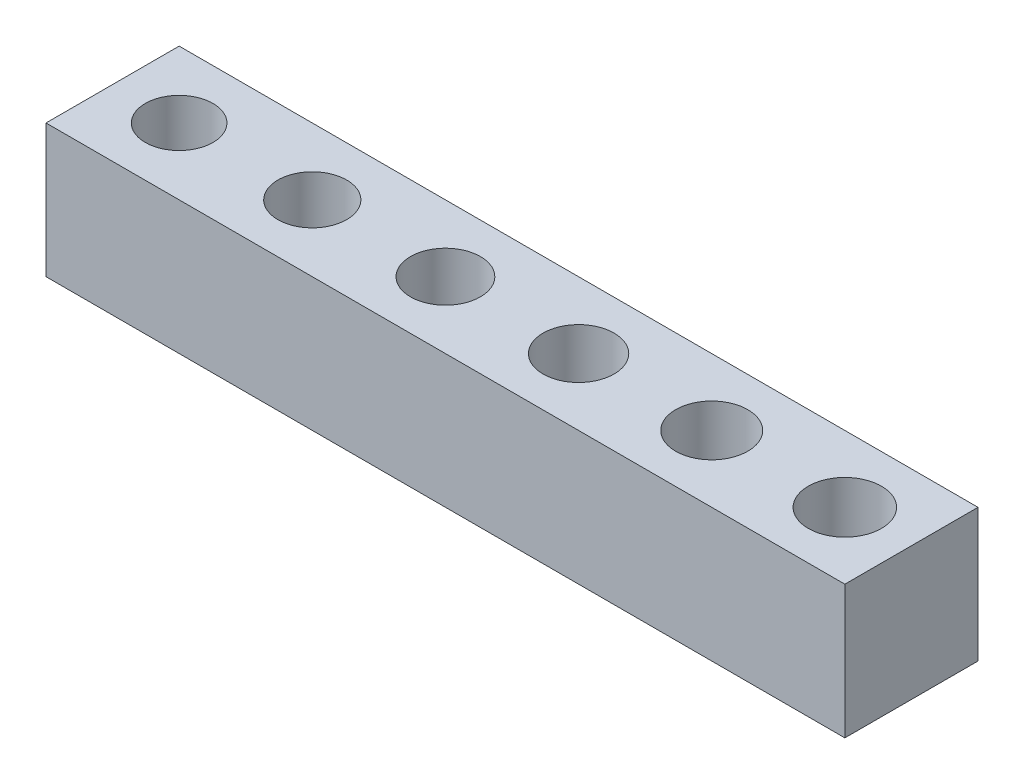
ISO-10303-21;
HEADER;
FILE_DESCRIPTION(('STEP AP214'),'2;1');
FILE_NAME('part.step','',(''),(''),'','','');
FILE_SCHEMA(('AUTOMOTIVE_DESIGN { 1 0 10303 214 1 1 1 1 }'));
ENDSEC;
DATA;
#1=APPLICATION_CONTEXT('core data for automotive mechanical design processes');
#2=APPLICATION_PROTOCOL_DEFINITION('international standard','automotive_design',2000,#1);
#3=PRODUCT_CONTEXT('',#1,'mechanical');
#4=PRODUCT('Part','Part','',(#3));
#5=PRODUCT_RELATED_PRODUCT_CATEGORY('part','',(#4));
#6=PRODUCT_DEFINITION_FORMATION('','',#4);
#7=PRODUCT_DEFINITION_CONTEXT('part definition',#1,'design');
#8=PRODUCT_DEFINITION('design','',#6,#7);
#9=PRODUCT_DEFINITION_SHAPE('','',#8);
#10=(LENGTH_UNIT() NAMED_UNIT(*) SI_UNIT(.MILLI.,.METRE.));
#11=(NAMED_UNIT(*) PLANE_ANGLE_UNIT() SI_UNIT($,.RADIAN.));
#12=(NAMED_UNIT(*) SI_UNIT($,.STERADIAN.) SOLID_ANGLE_UNIT());
#13=UNCERTAINTY_MEASURE_WITH_UNIT(LENGTH_MEASURE(1.E-05),#10,'distance_accuracy_value','');
#14=(GEOMETRIC_REPRESENTATION_CONTEXT(3) GLOBAL_UNCERTAINTY_ASSIGNED_CONTEXT((#13)) GLOBAL_UNIT_ASSIGNED_CONTEXT((#10,
#11,#12)) REPRESENTATION_CONTEXT('',''));
#15=CARTESIAN_POINT('',(0.,0.,0.));
#16=DIRECTION('',(0.,0.,1.));
#17=DIRECTION('',(1.,0.,0.));
#18=AXIS2_PLACEMENT_3D('',#15,#16,#17);
#19=CARTESIAN_POINT('',(6.,12.,-6.));
#20=DIRECTION('',(0.,-1.,0.));
#21=DIRECTION('',(0.,0.,-1.));
#22=AXIS2_PLACEMENT_3D('',#19,#20,#21);
#23=CYLINDRICAL_SURFACE('',#22,2.475);
#24=CARTESIAN_POINT('',(6.,0.,-6.));
#25=DIRECTION('',(0.,1.,0.));
#26=DIRECTION('',(0.,0.,1.));
#27=AXIS2_PLACEMENT_3D('',#24,#25,#26);
#28=CIRCLE('',#27,2.475);
#29=CARTESIAN_POINT('',(6.,0.,-3.525));
#30=VERTEX_POINT('',#29);
#31=EDGE_CURVE('E129',#30,#30,#28,.T.);
#32=ORIENTED_EDGE('',*,*,#31,.F.);
#33=EDGE_LOOP('',(#32));
#34=FACE_BOUND('',#33,.T.);
#35=CARTESIAN_POINT('',(6.,6.25,-6.));
#36=DIRECTION('',(0.,1.,0.));
#37=DIRECTION('',(0.,0.,1.));
#38=AXIS2_PLACEMENT_3D('',#35,#36,#37);
#39=CIRCLE('',#38,2.475);
#40=CARTESIAN_POINT('',(6.,6.25,-3.525));
#41=VERTEX_POINT('',#40);
#42=EDGE_CURVE('E43',#41,#41,#39,.T.);
#43=ORIENTED_EDGE('',*,*,#42,.T.);
#44=EDGE_LOOP('',(#43));
#45=FACE_BOUND('',#44,.T.);
#46=ADVANCED_FACE('F39',(#34,#45),#23,.F.);
#47=CARTESIAN_POINT('',(18.,12.,-6.));
#48=DIRECTION('',(0.,-1.,0.));
#49=DIRECTION('',(0.,0.,-1.));
#50=AXIS2_PLACEMENT_3D('',#47,#48,#49);
#51=CYLINDRICAL_SURFACE('',#50,2.475);
#52=CARTESIAN_POINT('',(18.,0.,-6.));
#53=DIRECTION('',(0.,1.,0.));
#54=DIRECTION('',(0.,0.,1.));
#55=AXIS2_PLACEMENT_3D('',#52,#53,#54);
#56=CIRCLE('',#55,2.475);
#57=CARTESIAN_POINT('',(18.,0.,-3.525));
#58=VERTEX_POINT('',#57);
#59=EDGE_CURVE('E119',#58,#58,#56,.T.);
#60=ORIENTED_EDGE('',*,*,#59,.F.);
#61=EDGE_LOOP('',(#60));
#62=FACE_BOUND('',#61,.T.);
#63=CARTESIAN_POINT('',(18.,6.25,-6.));
#64=DIRECTION('',(0.,1.,0.));
#65=DIRECTION('',(0.,0.,1.));
#66=AXIS2_PLACEMENT_3D('',#63,#64,#65);
#67=CIRCLE('',#66,2.475);
#68=CARTESIAN_POINT('',(18.,6.25,-3.525));
#69=VERTEX_POINT('',#68);
#70=EDGE_CURVE('E146',#69,#69,#67,.T.);
#71=ORIENTED_EDGE('',*,*,#70,.T.);
#72=EDGE_LOOP('',(#71));
#73=FACE_BOUND('',#72,.T.);
#74=ADVANCED_FACE('F204',(#62,#73),#51,.F.);
#75=CARTESIAN_POINT('',(-6.,12.,-6.));
#76=DIRECTION('',(0.,-1.,0.));
#77=DIRECTION('',(0.,0.,-1.));
#78=AXIS2_PLACEMENT_3D('',#75,#76,#77);
#79=CYLINDRICAL_SURFACE('',#78,2.475);
#80=CARTESIAN_POINT('',(-6.,0.,-6.));
#81=DIRECTION('',(0.,1.,0.));
#82=DIRECTION('',(0.,0.,1.));
#83=AXIS2_PLACEMENT_3D('',#80,#81,#82);
#84=CIRCLE('',#83,2.475);
#85=CARTESIAN_POINT('',(-6.,0.,-3.525));
#86=VERTEX_POINT('',#85);
#87=EDGE_CURVE('E116',#86,#86,#84,.T.);
#88=ORIENTED_EDGE('',*,*,#87,.F.);
#89=EDGE_LOOP('',(#88));
#90=FACE_BOUND('',#89,.T.);
#91=CARTESIAN_POINT('',(-6.,6.25,-6.));
#92=DIRECTION('',(0.,1.,0.));
#93=DIRECTION('',(0.,0.,1.));
#94=AXIS2_PLACEMENT_3D('',#91,#92,#93);
#95=CIRCLE('',#94,2.475);
#96=CARTESIAN_POINT('',(-6.,6.25,-3.525));
#97=VERTEX_POINT('',#96);
#98=EDGE_CURVE('E144',#97,#97,#95,.T.);
#99=ORIENTED_EDGE('',*,*,#98,.T.);
#100=EDGE_LOOP('',(#99));
#101=FACE_BOUND('',#100,.T.);
#102=ADVANCED_FACE('F210',(#90,#101),#79,.F.);
#103=CARTESIAN_POINT('',(-18.,12.,-6.));
#104=DIRECTION('',(0.,-1.,0.));
#105=DIRECTION('',(0.,0.,-1.));
#106=AXIS2_PLACEMENT_3D('',#103,#104,#105);
#107=CYLINDRICAL_SURFACE('',#106,2.475);
#108=CARTESIAN_POINT('',(-18.,0.,-6.));
#109=DIRECTION('',(0.,1.,0.));
#110=DIRECTION('',(0.,0.,1.));
#111=AXIS2_PLACEMENT_3D('',#108,#109,#110);
#112=CIRCLE('',#111,2.475);
#113=CARTESIAN_POINT('',(-18.,0.,-3.525));
#114=VERTEX_POINT('',#113);
#115=EDGE_CURVE('E113',#114,#114,#112,.T.);
#116=ORIENTED_EDGE('',*,*,#115,.F.);
#117=EDGE_LOOP('',(#116));
#118=FACE_BOUND('',#117,.T.);
#119=CARTESIAN_POINT('',(-18.,6.25,-6.));
#120=DIRECTION('',(0.,1.,0.));
#121=DIRECTION('',(0.,0.,1.));
#122=AXIS2_PLACEMENT_3D('',#119,#120,#121);
#123=CIRCLE('',#122,2.475);
#124=CARTESIAN_POINT('',(-18.,6.25,-3.525));
#125=VERTEX_POINT('',#124);
#126=EDGE_CURVE('E141',#125,#125,#123,.T.);
#127=ORIENTED_EDGE('',*,*,#126,.T.);
#128=EDGE_LOOP('',(#127));
#129=FACE_BOUND('',#128,.T.);
#130=ADVANCED_FACE('F221',(#118,#129),#107,.F.);
#131=CARTESIAN_POINT('',(-30.,12.,-6.));
#132=DIRECTION('',(0.,-1.,0.));
#133=DIRECTION('',(0.,0.,-1.));
#134=AXIS2_PLACEMENT_3D('',#131,#132,#133);
#135=CYLINDRICAL_SURFACE('',#134,2.475);
#136=CARTESIAN_POINT('',(-30.,0.,-6.));
#137=DIRECTION('',(0.,1.,0.));
#138=DIRECTION('',(0.,0.,1.));
#139=AXIS2_PLACEMENT_3D('',#136,#137,#138);
#140=CIRCLE('',#139,2.475);
#141=CARTESIAN_POINT('',(-30.,0.,-3.525));
#142=VERTEX_POINT('',#141);
#143=EDGE_CURVE('E110',#142,#142,#140,.T.);
#144=ORIENTED_EDGE('',*,*,#143,.F.);
#145=EDGE_LOOP('',(#144));
#146=FACE_BOUND('',#145,.T.);
#147=CARTESIAN_POINT('',(-30.,6.25,-6.));
#148=DIRECTION('',(0.,1.,0.));
#149=DIRECTION('',(0.,0.,1.));
#150=AXIS2_PLACEMENT_3D('',#147,#148,#149);
#151=CIRCLE('',#150,2.475);
#152=CARTESIAN_POINT('',(-30.,6.25,-3.525));
#153=VERTEX_POINT('',#152);
#154=EDGE_CURVE('E137',#153,#153,#151,.T.);
#155=ORIENTED_EDGE('',*,*,#154,.T.);
#156=EDGE_LOOP('',(#155));
#157=FACE_BOUND('',#156,.T.);
#158=ADVANCED_FACE('F197',(#146,#157),#135,.F.);
#159=CARTESIAN_POINT('',(-42.,12.,-6.));
#160=DIRECTION('',(0.,-1.,0.));
#161=DIRECTION('',(0.,0.,-1.));
#162=AXIS2_PLACEMENT_3D('',#159,#160,#161);
#163=CYLINDRICAL_SURFACE('',#162,2.475);
#164=CARTESIAN_POINT('',(-42.,0.,-6.));
#165=DIRECTION('',(0.,1.,0.));
#166=DIRECTION('',(0.,0.,1.));
#167=AXIS2_PLACEMENT_3D('',#164,#165,#166);
#168=CIRCLE('',#167,2.475);
#169=CARTESIAN_POINT('',(-42.,0.,-3.525));
#170=VERTEX_POINT('',#169);
#171=EDGE_CURVE('E103',#170,#170,#168,.T.);
#172=ORIENTED_EDGE('',*,*,#171,.F.);
#173=EDGE_LOOP('',(#172));
#174=FACE_BOUND('',#173,.T.);
#175=CARTESIAN_POINT('',(-42.,6.25,-6.));
#176=DIRECTION('',(0.,1.,0.));
#177=DIRECTION('',(0.,0.,1.));
#178=AXIS2_PLACEMENT_3D('',#175,#176,#177);
#179=CIRCLE('',#178,2.475);
#180=CARTESIAN_POINT('',(-42.,6.25,-3.525));
#181=VERTEX_POINT('',#180);
#182=EDGE_CURVE('E134',#181,#181,#179,.T.);
#183=ORIENTED_EDGE('',*,*,#182,.T.);
#184=EDGE_LOOP('',(#183));
#185=FACE_BOUND('',#184,.T.);
#186=ADVANCED_FACE('F188',(#174,#185),#163,.F.);
#187=CARTESIAN_POINT('',(0.,12.,0.));
#188=DIRECTION('',(0.,-1.,0.));
#189=DIRECTION('',(0.,0.,-1.));
#190=AXIS2_PLACEMENT_3D('',#187,#188,#189);
#191=PLANE('',#190);
#192=CARTESIAN_POINT('',(-42.,12.,-6.));
#193=DIRECTION('',(0.,1.,0.));
#194=DIRECTION('',(0.,0.,1.));
#195=AXIS2_PLACEMENT_3D('',#192,#193,#194);
#196=CIRCLE('',#195,3.05);
#197=CARTESIAN_POINT('',(-42.,12.,-2.95));
#198=VERTEX_POINT('',#197);
#199=EDGE_CURVE('E270',#198,#198,#196,.T.);
#200=ORIENTED_EDGE('',*,*,#199,.F.);
#201=EDGE_LOOP('',(#200));
#202=FACE_BOUND('',#201,.T.);
#203=CARTESIAN_POINT('',(-30.,12.,-6.));
#204=DIRECTION('',(0.,1.,0.));
#205=DIRECTION('',(0.,0.,1.));
#206=AXIS2_PLACEMENT_3D('',#203,#204,#205);
#207=CIRCLE('',#206,3.1);
#208=CARTESIAN_POINT('',(-30.,12.,-2.9));
#209=VERTEX_POINT('',#208);
#210=EDGE_CURVE('E273',#209,#209,#207,.T.);
#211=ORIENTED_EDGE('',*,*,#210,.F.);
#212=EDGE_LOOP('',(#211));
#213=FACE_BOUND('',#212,.T.);
#214=CARTESIAN_POINT('',(-18.,12.,-6.));
#215=DIRECTION('',(0.,1.,0.));
#216=DIRECTION('',(0.,0.,1.));
#217=AXIS2_PLACEMENT_3D('',#214,#215,#216);
#218=CIRCLE('',#217,3.15);
#219=CARTESIAN_POINT('',(-18.,12.,-2.85));
#220=VERTEX_POINT('',#219);
#221=EDGE_CURVE('E281',#220,#220,#218,.T.);
#222=ORIENTED_EDGE('',*,*,#221,.F.);
#223=EDGE_LOOP('',(#222));
#224=FACE_BOUND('',#223,.T.);
#225=CARTESIAN_POINT('',(-6.,12.,-6.));
#226=DIRECTION('',(0.,1.,0.));
#227=DIRECTION('',(0.,0.,1.));
#228=AXIS2_PLACEMENT_3D('',#225,#226,#227);
#229=CIRCLE('',#228,3.2);
#230=CARTESIAN_POINT('',(-6.,12.,-2.8));
#231=VERTEX_POINT('',#230);
#232=EDGE_CURVE('E287',#231,#231,#229,.T.);
#233=ORIENTED_EDGE('',*,*,#232,.F.);
#234=EDGE_LOOP('',(#233));
#235=FACE_BOUND('',#234,.T.);
#236=CARTESIAN_POINT('',(6.,12.,-6.));
#237=DIRECTION('',(0.,1.,0.));
#238=DIRECTION('',(0.,0.,1.));
#239=AXIS2_PLACEMENT_3D('',#236,#237,#238);
#240=CIRCLE('',#239,3.25);
#241=CARTESIAN_POINT('',(6.,12.,-2.75));
#242=VERTEX_POINT('',#241);
#243=EDGE_CURVE('E163',#242,#242,#240,.T.);
#244=ORIENTED_EDGE('',*,*,#243,.F.);
#245=EDGE_LOOP('',(#244));
#246=FACE_BOUND('',#245,.T.);
#247=CARTESIAN_POINT('',(18.,12.,-6.));
#248=DIRECTION('',(0.,1.,0.));
#249=DIRECTION('',(0.,0.,1.));
#250=AXIS2_PLACEMENT_3D('',#247,#248,#249);
#251=CIRCLE('',#250,3.3);
#252=CARTESIAN_POINT('',(18.,12.,-2.7));
#253=VERTEX_POINT('',#252);
#254=EDGE_CURVE('E164',#253,#253,#251,.T.);
#255=ORIENTED_EDGE('',*,*,#254,.F.);
#256=EDGE_LOOP('',(#255));
#257=FACE_BOUND('',#256,.T.);
#258=DIRECTION('',(-1.,0.,0.));
#259=VECTOR('',#258,1.);
#260=CARTESIAN_POINT('',(0.,12.,-12.));
#261=LINE('',#260,#259);
#262=CARTESIAN_POINT('',(24.,12.,-12.));
#263=VERTEX_POINT('',#262);
#264=CARTESIAN_POINT('',(-48.,12.,-12.));
#265=VERTEX_POINT('',#264);
#266=EDGE_CURVE('E11',#263,#265,#261,.T.);
#267=ORIENTED_EDGE('',*,*,#266,.T.);
#268=DIRECTION('',(0.,0.,1.));
#269=VECTOR('',#268,1.);
#270=CARTESIAN_POINT('',(-48.,12.,0.));
#271=LINE('',#270,#269);
#272=CARTESIAN_POINT('',(-48.,12.,0.));
#273=VERTEX_POINT('',#272);
#274=EDGE_CURVE('E98',#265,#273,#271,.T.);
#275=ORIENTED_EDGE('',*,*,#274,.T.);
#276=DIRECTION('',(1.,0.,0.));
#277=VECTOR('',#276,1.);
#278=CARTESIAN_POINT('',(0.,12.,0.));
#279=LINE('',#278,#277);
#280=CARTESIAN_POINT('',(24.,12.,0.));
#281=VERTEX_POINT('',#280);
#282=EDGE_CURVE('E49',#273,#281,#279,.T.);
#283=ORIENTED_EDGE('',*,*,#282,.T.);
#284=DIRECTION('',(0.,0.,-1.));
#285=VECTOR('',#284,1.);
#286=CARTESIAN_POINT('',(24.,12.,0.));
#287=LINE('',#286,#285);
#288=EDGE_CURVE('E123',#281,#263,#287,.T.);
#289=ORIENTED_EDGE('',*,*,#288,.T.);
#290=EDGE_LOOP('',(#267,#275,#283,#289));
#291=FACE_BOUND('',#290,.T.);
#292=ADVANCED_FACE('F186',(#202,#213,#224,#235,#246,#257,#291),#191,.F.);
#293=CARTESIAN_POINT('',(0.,0.,0.));
#294=DIRECTION('',(0.,-1.,0.));
#295=DIRECTION('',(0.,0.,-1.));
#296=AXIS2_PLACEMENT_3D('',#293,#294,#295);
#297=PLANE('',#296);
#298=DIRECTION('',(1.,0.,0.));
#299=VECTOR('',#298,1.);
#300=CARTESIAN_POINT('',(0.,0.,0.));
#301=LINE('',#300,#299);
#302=CARTESIAN_POINT('',(-48.,0.,0.));
#303=VERTEX_POINT('',#302);
#304=CARTESIAN_POINT('',(24.,0.,0.));
#305=VERTEX_POINT('',#304);
#306=EDGE_CURVE('E68',#303,#305,#301,.T.);
#307=ORIENTED_EDGE('',*,*,#306,.F.);
#308=DIRECTION('',(0.,0.,1.));
#309=VECTOR('',#308,1.);
#310=CARTESIAN_POINT('',(-48.,0.,0.));
#311=LINE('',#310,#309);
#312=CARTESIAN_POINT('',(-48.,0.,-12.));
#313=VERTEX_POINT('',#312);
#314=EDGE_CURVE('E97',#313,#303,#311,.T.);
#315=ORIENTED_EDGE('',*,*,#314,.F.);
#316=DIRECTION('',(-1.,0.,0.));
#317=VECTOR('',#316,1.);
#318=CARTESIAN_POINT('',(0.,0.,-12.));
#319=LINE('',#318,#317);
#320=CARTESIAN_POINT('',(24.,0.,-12.));
#321=VERTEX_POINT('',#320);
#322=EDGE_CURVE('E81',#321,#313,#319,.T.);
#323=ORIENTED_EDGE('',*,*,#322,.F.);
#324=DIRECTION('',(0.,0.,-1.));
#325=VECTOR('',#324,1.);
#326=CARTESIAN_POINT('',(24.,0.,0.));
#327=LINE('',#326,#325);
#328=EDGE_CURVE('E122',#305,#321,#327,.T.);
#329=ORIENTED_EDGE('',*,*,#328,.F.);
#330=EDGE_LOOP('',(#307,#315,#323,#329));
#331=FACE_BOUND('',#330,.T.);
#332=ORIENTED_EDGE('',*,*,#31,.T.);
#333=EDGE_LOOP('',(#332));
#334=FACE_BOUND('',#333,.T.);
#335=ORIENTED_EDGE('',*,*,#59,.T.);
#336=EDGE_LOOP('',(#335));
#337=FACE_BOUND('',#336,.T.);
#338=ORIENTED_EDGE('',*,*,#171,.T.);
#339=EDGE_LOOP('',(#338));
#340=FACE_BOUND('',#339,.T.);
#341=ORIENTED_EDGE('',*,*,#143,.T.);
#342=EDGE_LOOP('',(#341));
#343=FACE_BOUND('',#342,.T.);
#344=ORIENTED_EDGE('',*,*,#115,.T.);
#345=EDGE_LOOP('',(#344));
#346=FACE_BOUND('',#345,.T.);
#347=ORIENTED_EDGE('',*,*,#87,.T.);
#348=EDGE_LOOP('',(#347));
#349=FACE_BOUND('',#348,.T.);
#350=ADVANCED_FACE('F101',(#331,#334,#337,#340,#343,#346,#349),#297,.T.);
#351=CARTESIAN_POINT('',(0.,12.,0.));
#352=DIRECTION('',(0.,0.,-1.));
#353=DIRECTION('',(-1.,0.,0.));
#354=AXIS2_PLACEMENT_3D('',#351,#352,#353);
#355=PLANE('',#354);
#356=ORIENTED_EDGE('',*,*,#306,.T.);
#357=DIRECTION('',(0.,-1.,0.));
#358=VECTOR('',#357,1.);
#359=CARTESIAN_POINT('',(24.,12.,0.));
#360=LINE('',#359,#358);
#361=EDGE_CURVE('E127',#281,#305,#360,.T.);
#362=ORIENTED_EDGE('',*,*,#361,.F.);
#363=ORIENTED_EDGE('',*,*,#282,.F.);
#364=DIRECTION('',(0.,-1.,0.));
#365=VECTOR('',#364,1.);
#366=CARTESIAN_POINT('',(-48.,12.,0.));
#367=LINE('',#366,#365);
#368=EDGE_CURVE('E99',#273,#303,#367,.T.);
#369=ORIENTED_EDGE('',*,*,#368,.T.);
#370=EDGE_LOOP('',(#356,#362,#363,#369));
#371=FACE_BOUND('',#370,.T.);
#372=ADVANCED_FACE('F41',(#371),#355,.F.);
#373=CARTESIAN_POINT('',(0.,12.,-12.));
#374=DIRECTION('',(0.,0.,1.));
#375=DIRECTION('',(1.,0.,0.));
#376=AXIS2_PLACEMENT_3D('',#373,#374,#375);
#377=PLANE('',#376);
#378=ORIENTED_EDGE('',*,*,#322,.T.);
#379=DIRECTION('',(0.,-1.,0.));
#380=VECTOR('',#379,1.);
#381=CARTESIAN_POINT('',(-48.,12.,-12.));
#382=LINE('',#381,#380);
#383=EDGE_CURVE('E84',#265,#313,#382,.T.);
#384=ORIENTED_EDGE('',*,*,#383,.F.);
#385=ORIENTED_EDGE('',*,*,#266,.F.);
#386=DIRECTION('',(0.,-1.,0.));
#387=VECTOR('',#386,1.);
#388=CARTESIAN_POINT('',(24.,12.,-12.));
#389=LINE('',#388,#387);
#390=EDGE_CURVE('E87',#263,#321,#389,.T.);
#391=ORIENTED_EDGE('',*,*,#390,.T.);
#392=EDGE_LOOP('',(#378,#384,#385,#391));
#393=FACE_BOUND('',#392,.T.);
#394=ADVANCED_FACE('F83',(#393),#377,.F.);
#395=CARTESIAN_POINT('',(24.,12.,0.));
#396=DIRECTION('',(-1.,0.,0.));
#397=DIRECTION('',(0.,0.,1.));
#398=AXIS2_PLACEMENT_3D('',#395,#396,#397);
#399=PLANE('',#398);
#400=ORIENTED_EDGE('',*,*,#328,.T.);
#401=ORIENTED_EDGE('',*,*,#390,.F.);
#402=ORIENTED_EDGE('',*,*,#288,.F.);
#403=ORIENTED_EDGE('',*,*,#361,.T.);
#404=EDGE_LOOP('',(#400,#401,#402,#403));
#405=FACE_BOUND('',#404,.T.);
#406=ADVANCED_FACE('F215',(#405),#399,.F.);
#407=CARTESIAN_POINT('',(-48.,12.,0.));
#408=DIRECTION('',(1.,0.,0.));
#409=DIRECTION('',(0.,0.,-1.));
#410=AXIS2_PLACEMENT_3D('',#407,#408,#409);
#411=PLANE('',#410);
#412=ORIENTED_EDGE('',*,*,#314,.T.);
#413=ORIENTED_EDGE('',*,*,#368,.F.);
#414=ORIENTED_EDGE('',*,*,#274,.F.);
#415=ORIENTED_EDGE('',*,*,#383,.T.);
#416=EDGE_LOOP('',(#412,#413,#414,#415));
#417=FACE_BOUND('',#416,.T.);
#418=ADVANCED_FACE('F95',(#417),#411,.F.);
#419=CARTESIAN_POINT('',(-42.,6.25,-6.));
#420=DIRECTION('',(0.,1.,0.));
#421=DIRECTION('',(0.,0.,1.));
#422=AXIS2_PLACEMENT_3D('',#419,#420,#421);
#423=CYLINDRICAL_SURFACE('',#422,3.05);
#424=CARTESIAN_POINT('',(-42.,6.25,-6.));
#425=DIRECTION('',(0.,1.,0.));
#426=DIRECTION('',(0.,0.,1.));
#427=AXIS2_PLACEMENT_3D('',#424,#425,#426);
#428=CIRCLE('',#427,3.05);
#429=CARTESIAN_POINT('',(-42.,6.25,-2.95));
#430=VERTEX_POINT('',#429);
#431=EDGE_CURVE('E138',#430,#430,#428,.T.);
#432=ORIENTED_EDGE('',*,*,#431,.F.);
#433=EDGE_LOOP('',(#432));
#434=FACE_BOUND('',#433,.T.);
#435=ORIENTED_EDGE('',*,*,#199,.T.);
#436=EDGE_LOOP('',(#435));
#437=FACE_BOUND('',#436,.T.);
#438=ADVANCED_FACE('F229',(#434,#437),#423,.F.);
#439=CARTESIAN_POINT('',(-42.,6.25,-6.));
#440=DIRECTION('',(0.,1.,0.));
#441=DIRECTION('',(0.,0.,1.));
#442=AXIS2_PLACEMENT_3D('',#439,#440,#441);
#443=PLANE('',#442);
#444=ORIENTED_EDGE('',*,*,#182,.F.);
#445=EDGE_LOOP('',(#444));
#446=FACE_BOUND('',#445,.T.);
#447=ORIENTED_EDGE('',*,*,#431,.T.);
#448=EDGE_LOOP('',(#447));
#449=FACE_BOUND('',#448,.T.);
#450=ADVANCED_FACE('F258',(#446,#449),#443,.T.);
#451=CARTESIAN_POINT('',(-30.,6.25,-6.));
#452=DIRECTION('',(0.,1.,0.));
#453=DIRECTION('',(0.,0.,1.));
#454=AXIS2_PLACEMENT_3D('',#451,#452,#453);
#455=CYLINDRICAL_SURFACE('',#454,3.1);
#456=CARTESIAN_POINT('',(-30.,6.25,-6.));
#457=DIRECTION('',(0.,1.,0.));
#458=DIRECTION('',(0.,0.,1.));
#459=AXIS2_PLACEMENT_3D('',#456,#457,#458);
#460=CIRCLE('',#459,3.1);
#461=CARTESIAN_POINT('',(-30.,6.25,-2.9));
#462=VERTEX_POINT('',#461);
#463=EDGE_CURVE('E278',#462,#462,#460,.T.);
#464=ORIENTED_EDGE('',*,*,#463,.F.);
#465=EDGE_LOOP('',(#464));
#466=FACE_BOUND('',#465,.T.);
#467=ORIENTED_EDGE('',*,*,#210,.T.);
#468=EDGE_LOOP('',(#467));
#469=FACE_BOUND('',#468,.T.);
#470=ADVANCED_FACE('F254',(#466,#469),#455,.F.);
#471=CARTESIAN_POINT('',(-30.,6.25,-6.));
#472=DIRECTION('',(0.,1.,0.));
#473=DIRECTION('',(0.,0.,1.));
#474=AXIS2_PLACEMENT_3D('',#471,#472,#473);
#475=PLANE('',#474);
#476=ORIENTED_EDGE('',*,*,#154,.F.);
#477=EDGE_LOOP('',(#476));
#478=FACE_BOUND('',#477,.T.);
#479=ORIENTED_EDGE('',*,*,#463,.T.);
#480=EDGE_LOOP('',(#479));
#481=FACE_BOUND('',#480,.T.);
#482=ADVANCED_FACE('F250',(#478,#481),#475,.T.);
#483=CARTESIAN_POINT('',(-18.,6.25,-6.));
#484=DIRECTION('',(0.,1.,0.));
#485=DIRECTION('',(0.,0.,1.));
#486=AXIS2_PLACEMENT_3D('',#483,#484,#485);
#487=CYLINDRICAL_SURFACE('',#486,3.15);
#488=CARTESIAN_POINT('',(-18.,6.25,-6.));
#489=DIRECTION('',(0.,1.,0.));
#490=DIRECTION('',(0.,0.,1.));
#491=AXIS2_PLACEMENT_3D('',#488,#489,#490);
#492=CIRCLE('',#491,3.15);
#493=CARTESIAN_POINT('',(-18.,6.25,-2.85));
#494=VERTEX_POINT('',#493);
#495=EDGE_CURVE('E284',#494,#494,#492,.T.);
#496=ORIENTED_EDGE('',*,*,#495,.F.);
#497=EDGE_LOOP('',(#496));
#498=FACE_BOUND('',#497,.T.);
#499=ORIENTED_EDGE('',*,*,#221,.T.);
#500=EDGE_LOOP('',(#499));
#501=FACE_BOUND('',#500,.T.);
#502=ADVANCED_FACE('F246',(#498,#501),#487,.F.);
#503=CARTESIAN_POINT('',(-18.,6.25,-6.));
#504=DIRECTION('',(0.,1.,0.));
#505=DIRECTION('',(0.,0.,1.));
#506=AXIS2_PLACEMENT_3D('',#503,#504,#505);
#507=PLANE('',#506);
#508=ORIENTED_EDGE('',*,*,#126,.F.);
#509=EDGE_LOOP('',(#508));
#510=FACE_BOUND('',#509,.T.);
#511=ORIENTED_EDGE('',*,*,#495,.T.);
#512=EDGE_LOOP('',(#511));
#513=FACE_BOUND('',#512,.T.);
#514=ADVANCED_FACE('F242',(#510,#513),#507,.T.);
#515=CARTESIAN_POINT('',(-6.,6.25,-6.));
#516=DIRECTION('',(0.,1.,0.));
#517=DIRECTION('',(0.,0.,1.));
#518=AXIS2_PLACEMENT_3D('',#515,#516,#517);
#519=CYLINDRICAL_SURFACE('',#518,3.2);
#520=CARTESIAN_POINT('',(-6.,6.25,-6.));
#521=DIRECTION('',(0.,1.,0.));
#522=DIRECTION('',(0.,0.,1.));
#523=AXIS2_PLACEMENT_3D('',#520,#521,#522);
#524=CIRCLE('',#523,3.2);
#525=CARTESIAN_POINT('',(-6.,6.25,-2.8));
#526=VERTEX_POINT('',#525);
#527=EDGE_CURVE('E167',#526,#526,#524,.T.);
#528=ORIENTED_EDGE('',*,*,#527,.F.);
#529=EDGE_LOOP('',(#528));
#530=FACE_BOUND('',#529,.T.);
#531=ORIENTED_EDGE('',*,*,#232,.T.);
#532=EDGE_LOOP('',(#531));
#533=FACE_BOUND('',#532,.T.);
#534=ADVANCED_FACE('F238',(#530,#533),#519,.F.);
#535=CARTESIAN_POINT('',(-6.,6.25,-6.));
#536=DIRECTION('',(0.,1.,0.));
#537=DIRECTION('',(0.,0.,1.));
#538=AXIS2_PLACEMENT_3D('',#535,#536,#537);
#539=PLANE('',#538);
#540=ORIENTED_EDGE('',*,*,#98,.F.);
#541=EDGE_LOOP('',(#540));
#542=FACE_BOUND('',#541,.T.);
#543=ORIENTED_EDGE('',*,*,#527,.T.);
#544=EDGE_LOOP('',(#543));
#545=FACE_BOUND('',#544,.T.);
#546=ADVANCED_FACE('F182',(#542,#545),#539,.T.);
#547=CARTESIAN_POINT('',(18.,6.25,-6.));
#548=DIRECTION('',(0.,1.,0.));
#549=DIRECTION('',(0.,0.,1.));
#550=AXIS2_PLACEMENT_3D('',#547,#548,#549);
#551=CYLINDRICAL_SURFACE('',#550,3.3);
#552=CARTESIAN_POINT('',(18.,6.25,-6.));
#553=DIRECTION('',(0.,1.,0.));
#554=DIRECTION('',(0.,0.,1.));
#555=AXIS2_PLACEMENT_3D('',#552,#553,#554);
#556=CIRCLE('',#555,3.3);
#557=CARTESIAN_POINT('',(18.,6.25,-2.7));
#558=VERTEX_POINT('',#557);
#559=EDGE_CURVE('E170',#558,#558,#556,.T.);
#560=ORIENTED_EDGE('',*,*,#559,.F.);
#561=EDGE_LOOP('',(#560));
#562=FACE_BOUND('',#561,.T.);
#563=ORIENTED_EDGE('',*,*,#254,.T.);
#564=EDGE_LOOP('',(#563));
#565=FACE_BOUND('',#564,.T.);
#566=ADVANCED_FACE('F179',(#562,#565),#551,.F.);
#567=CARTESIAN_POINT('',(18.,6.25,-6.));
#568=DIRECTION('',(0.,1.,0.));
#569=DIRECTION('',(0.,0.,1.));
#570=AXIS2_PLACEMENT_3D('',#567,#568,#569);
#571=PLANE('',#570);
#572=ORIENTED_EDGE('',*,*,#70,.F.);
#573=EDGE_LOOP('',(#572));
#574=FACE_BOUND('',#573,.T.);
#575=ORIENTED_EDGE('',*,*,#559,.T.);
#576=EDGE_LOOP('',(#575));
#577=FACE_BOUND('',#576,.T.);
#578=ADVANCED_FACE('F177',(#574,#577),#571,.T.);
#579=CARTESIAN_POINT('',(6.,6.25,-6.));
#580=DIRECTION('',(0.,1.,0.));
#581=DIRECTION('',(0.,0.,1.));
#582=AXIS2_PLACEMENT_3D('',#579,#580,#581);
#583=CYLINDRICAL_SURFACE('',#582,3.25);
#584=CARTESIAN_POINT('',(6.,6.25,-6.));
#585=DIRECTION('',(0.,1.,0.));
#586=DIRECTION('',(0.,0.,1.));
#587=AXIS2_PLACEMENT_3D('',#584,#585,#586);
#588=CIRCLE('',#587,3.25);
#589=CARTESIAN_POINT('',(6.,6.25,-2.75));
#590=VERTEX_POINT('',#589);
#591=EDGE_CURVE('E161',#590,#590,#588,.T.);
#592=ORIENTED_EDGE('',*,*,#591,.F.);
#593=EDGE_LOOP('',(#592));
#594=FACE_BOUND('',#593,.T.);
#595=ORIENTED_EDGE('',*,*,#243,.T.);
#596=EDGE_LOOP('',(#595));
#597=FACE_BOUND('',#596,.T.);
#598=ADVANCED_FACE('F157',(#594,#597),#583,.F.);
#599=CARTESIAN_POINT('',(6.,6.25,-6.));
#600=DIRECTION('',(0.,1.,0.));
#601=DIRECTION('',(0.,0.,1.));
#602=AXIS2_PLACEMENT_3D('',#599,#600,#601);
#603=PLANE('',#602);
#604=ORIENTED_EDGE('',*,*,#42,.F.);
#605=EDGE_LOOP('',(#604));
#606=FACE_BOUND('',#605,.T.);
#607=ORIENTED_EDGE('',*,*,#591,.T.);
#608=EDGE_LOOP('',(#607));
#609=FACE_BOUND('',#608,.T.);
#610=ADVANCED_FACE('F154',(#606,#609),#603,.T.);
#611=CLOSED_SHELL('',(#46,#74,#102,#130,#158,#186,#292,#350,#372,#394,#406,#418,#438,#450,#470,
#482,#502,#514,#534,#546,#566,#578,#598,#610));
#612=MANIFOLD_SOLID_BREP('B2',#611);
#613=ADVANCED_BREP_SHAPE_REPRESENTATION('',(#18,#612),#14);
#614=SHAPE_DEFINITION_REPRESENTATION(#9,#613);
ENDSEC;
END-ISO-10303-21;
